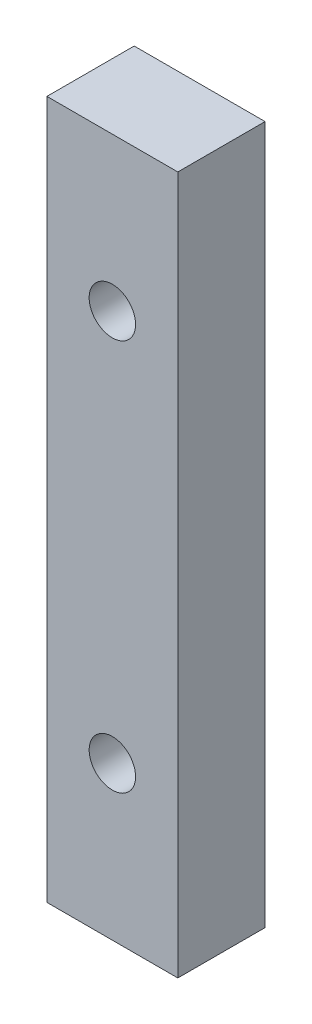
ISO-10303-21;
HEADER;
FILE_DESCRIPTION(('STEP AP214'),'2;1');
FILE_NAME('part.step','',(''),(''),'','','');
FILE_SCHEMA(('AUTOMOTIVE_DESIGN { 1 0 10303 214 1 1 1 1 }'));
ENDSEC;
DATA;
#1=APPLICATION_CONTEXT('core data for automotive mechanical design processes');
#2=APPLICATION_PROTOCOL_DEFINITION('international standard','automotive_design',2000,#1);
#3=PRODUCT_CONTEXT('',#1,'mechanical');
#4=PRODUCT('Part','Part','',(#3));
#5=PRODUCT_RELATED_PRODUCT_CATEGORY('part','',(#4));
#6=PRODUCT_DEFINITION_FORMATION('','',#4);
#7=PRODUCT_DEFINITION_CONTEXT('part definition',#1,'design');
#8=PRODUCT_DEFINITION('design','',#6,#7);
#9=PRODUCT_DEFINITION_SHAPE('','',#8);
#10=(LENGTH_UNIT() NAMED_UNIT(*) SI_UNIT(.MILLI.,.METRE.));
#11=(NAMED_UNIT(*) PLANE_ANGLE_UNIT() SI_UNIT($,.RADIAN.));
#12=(NAMED_UNIT(*) SI_UNIT($,.STERADIAN.) SOLID_ANGLE_UNIT());
#13=UNCERTAINTY_MEASURE_WITH_UNIT(LENGTH_MEASURE(1.E-05),#10,'distance_accuracy_value','');
#14=(GEOMETRIC_REPRESENTATION_CONTEXT(3) GLOBAL_UNCERTAINTY_ASSIGNED_CONTEXT((#13)) GLOBAL_UNIT_ASSIGNED_CONTEXT((#10,
#11,#12)) REPRESENTATION_CONTEXT('',''));
#15=CARTESIAN_POINT('',(0.,0.,0.));
#16=DIRECTION('',(0.,0.,1.));
#17=DIRECTION('',(1.,0.,0.));
#18=AXIS2_PLACEMENT_3D('',#15,#16,#17);
#19=CARTESIAN_POINT('',(-9.52500000000001,50.8,12.7));
#20=DIRECTION('',(1.,0.,0.));
#21=DIRECTION('',(0.,1.,0.));
#22=AXIS2_PLACEMENT_3D('',#19,#20,#21);
#23=PLANE('',#22);
#24=DIRECTION('',(0.,-1.,0.));
#25=VECTOR('',#24,1.);
#26=CARTESIAN_POINT('',(-9.52500000000001,50.8,0.));
#27=LINE('',#26,#25);
#28=CARTESIAN_POINT('',(-9.52500000000001,50.8,0.));
#29=VERTEX_POINT('',#28);
#30=CARTESIAN_POINT('',(-9.525,-50.8,0.));
#31=VERTEX_POINT('',#30);
#32=EDGE_CURVE('E97',#29,#31,#27,.T.);
#33=ORIENTED_EDGE('',*,*,#32,.T.);
#34=DIRECTION('',(0.,0.,-1.));
#35=VECTOR('',#34,1.);
#36=CARTESIAN_POINT('',(-9.525,-50.8,12.7));
#37=LINE('',#36,#35);
#38=CARTESIAN_POINT('',(-9.525,-50.8,12.7));
#39=VERTEX_POINT('',#38);
#40=EDGE_CURVE('E11',#39,#31,#37,.T.);
#41=ORIENTED_EDGE('',*,*,#40,.F.);
#42=DIRECTION('',(0.,-1.,0.));
#43=VECTOR('',#42,1.);
#44=CARTESIAN_POINT('',(-9.52500000000001,50.8,12.7));
#45=LINE('',#44,#43);
#46=CARTESIAN_POINT('',(-9.52500000000001,50.8,12.7));
#47=VERTEX_POINT('',#46);
#48=EDGE_CURVE('E85',#47,#39,#45,.T.);
#49=ORIENTED_EDGE('',*,*,#48,.F.);
#50=DIRECTION('',(0.,0.,-1.));
#51=VECTOR('',#50,1.);
#52=CARTESIAN_POINT('',(-9.52500000000001,50.8,12.7));
#53=LINE('',#52,#51);
#54=EDGE_CURVE('E93',#47,#29,#53,.T.);
#55=ORIENTED_EDGE('',*,*,#54,.T.);
#56=EDGE_LOOP('',(#33,#41,#49,#55));
#57=FACE_BOUND('',#56,.T.);
#58=ADVANCED_FACE('F34',(#57),#23,.F.);
#59=CARTESIAN_POINT('',(-9.525,-50.8,12.7));
#60=DIRECTION('',(0.,1.,0.));
#61=DIRECTION('',(0.,0.,1.));
#62=AXIS2_PLACEMENT_3D('',#59,#60,#61);
#63=PLANE('',#62);
#64=DIRECTION('',(1.,0.,0.));
#65=VECTOR('',#64,1.);
#66=CARTESIAN_POINT('',(-9.525,-50.8,0.));
#67=LINE('',#66,#65);
#68=CARTESIAN_POINT('',(9.525,-50.8,0.));
#69=VERTEX_POINT('',#68);
#70=EDGE_CURVE('E89',#31,#69,#67,.T.);
#71=ORIENTED_EDGE('',*,*,#70,.T.);
#72=DIRECTION('',(0.,0.,-1.));
#73=VECTOR('',#72,1.);
#74=CARTESIAN_POINT('',(9.525,-50.8,12.7));
#75=LINE('',#74,#73);
#76=CARTESIAN_POINT('',(9.525,-50.8,12.7));
#77=VERTEX_POINT('',#76);
#78=EDGE_CURVE('E42',#77,#69,#75,.T.);
#79=ORIENTED_EDGE('',*,*,#78,.F.);
#80=DIRECTION('',(1.,0.,0.));
#81=VECTOR('',#80,1.);
#82=CARTESIAN_POINT('',(-9.525,-50.8,12.7));
#83=LINE('',#82,#81);
#84=EDGE_CURVE('E80',#39,#77,#83,.T.);
#85=ORIENTED_EDGE('',*,*,#84,.F.);
#86=ORIENTED_EDGE('',*,*,#40,.T.);
#87=EDGE_LOOP('',(#71,#79,#85,#86));
#88=FACE_BOUND('',#87,.T.);
#89=ADVANCED_FACE('F88',(#88),#63,.F.);
#90=CARTESIAN_POINT('',(9.52499999999999,50.8,12.7));
#91=DIRECTION('',(-1.,0.,0.));
#92=DIRECTION('',(0.,-1.,0.));
#93=AXIS2_PLACEMENT_3D('',#90,#91,#92);
#94=PLANE('',#93);
#95=DIRECTION('',(0.,1.,0.));
#96=VECTOR('',#95,1.);
#97=CARTESIAN_POINT('',(9.52499999999999,50.8,0.));
#98=LINE('',#97,#96);
#99=CARTESIAN_POINT('',(9.52499999999999,50.8,0.));
#100=VERTEX_POINT('',#99);
#101=EDGE_CURVE('E67',#69,#100,#98,.T.);
#102=ORIENTED_EDGE('',*,*,#101,.T.);
#103=DIRECTION('',(0.,0.,-1.));
#104=VECTOR('',#103,1.);
#105=CARTESIAN_POINT('',(9.52499999999999,50.8,12.7));
#106=LINE('',#105,#104);
#107=CARTESIAN_POINT('',(9.52499999999999,50.8,12.7));
#108=VERTEX_POINT('',#107);
#109=EDGE_CURVE('E90',#108,#100,#106,.T.);
#110=ORIENTED_EDGE('',*,*,#109,.F.);
#111=DIRECTION('',(0.,1.,0.));
#112=VECTOR('',#111,1.);
#113=CARTESIAN_POINT('',(9.52499999999999,50.8,12.7));
#114=LINE('',#113,#112);
#115=EDGE_CURVE('E83',#77,#108,#114,.T.);
#116=ORIENTED_EDGE('',*,*,#115,.F.);
#117=ORIENTED_EDGE('',*,*,#78,.T.);
#118=EDGE_LOOP('',(#102,#110,#116,#117));
#119=FACE_BOUND('',#118,.T.);
#120=ADVANCED_FACE('F91',(#119),#94,.F.);
#121=CARTESIAN_POINT('',(-9.52500000000001,50.8,12.7));
#122=DIRECTION('',(0.,-1.,0.));
#123=DIRECTION('',(0.,0.,-1.));
#124=AXIS2_PLACEMENT_3D('',#121,#122,#123);
#125=PLANE('',#124);
#126=DIRECTION('',(-1.,0.,0.));
#127=VECTOR('',#126,1.);
#128=CARTESIAN_POINT('',(-9.52500000000001,50.8,0.));
#129=LINE('',#128,#127);
#130=EDGE_CURVE('E73',#100,#29,#129,.T.);
#131=ORIENTED_EDGE('',*,*,#130,.T.);
#132=ORIENTED_EDGE('',*,*,#54,.F.);
#133=DIRECTION('',(-1.,0.,0.));
#134=VECTOR('',#133,1.);
#135=CARTESIAN_POINT('',(-9.52500000000001,50.8,12.7));
#136=LINE('',#135,#134);
#137=EDGE_CURVE('E50',#108,#47,#136,.T.);
#138=ORIENTED_EDGE('',*,*,#137,.F.);
#139=ORIENTED_EDGE('',*,*,#109,.T.);
#140=EDGE_LOOP('',(#131,#132,#138,#139));
#141=FACE_BOUND('',#140,.T.);
#142=ADVANCED_FACE('F105',(#141),#125,.F.);
#143=CARTESIAN_POINT('',(0.,0.,12.7));
#144=DIRECTION('',(0.,0.,1.));
#145=DIRECTION('',(1.,0.,0.));
#146=AXIS2_PLACEMENT_3D('',#143,#144,#145);
#147=PLANE('',#146);
#148=CARTESIAN_POINT('',(0.,28.5,12.7));
#149=DIRECTION('',(0.,0.,1.));
#150=DIRECTION('',(1.,0.,0.));
#151=AXIS2_PLACEMENT_3D('',#148,#149,#150);
#152=CIRCLE('',#151,3.37819999999999);
#153=CARTESIAN_POINT('',(3.37819999999999,28.5,12.7));
#154=VERTEX_POINT('',#153);
#155=EDGE_CURVE('E119',#154,#154,#152,.T.);
#156=ORIENTED_EDGE('',*,*,#155,.F.);
#157=EDGE_LOOP('',(#156));
#158=FACE_BOUND('',#157,.T.);
#159=CARTESIAN_POINT('',(0.,-28.5,12.7));
#160=DIRECTION('',(0.,0.,1.));
#161=DIRECTION('',(1.,0.,0.));
#162=AXIS2_PLACEMENT_3D('',#159,#160,#161);
#163=CIRCLE('',#162,3.37819999999999);
#164=CARTESIAN_POINT('',(3.37819999999999,-28.5,12.7));
#165=VERTEX_POINT('',#164);
#166=EDGE_CURVE('E113',#165,#165,#163,.T.);
#167=ORIENTED_EDGE('',*,*,#166,.F.);
#168=EDGE_LOOP('',(#167));
#169=FACE_BOUND('',#168,.T.);
#170=ORIENTED_EDGE('',*,*,#48,.T.);
#171=ORIENTED_EDGE('',*,*,#84,.T.);
#172=ORIENTED_EDGE('',*,*,#115,.T.);
#173=ORIENTED_EDGE('',*,*,#137,.T.);
#174=EDGE_LOOP('',(#170,#171,#172,#173));
#175=FACE_BOUND('',#174,.T.);
#176=ADVANCED_FACE('F81',(#158,#169,#175),#147,.T.);
#177=CARTESIAN_POINT('',(0.,0.,0.));
#178=DIRECTION('',(0.,0.,1.));
#179=DIRECTION('',(1.,0.,0.));
#180=AXIS2_PLACEMENT_3D('',#177,#178,#179);
#181=PLANE('',#180);
#182=CARTESIAN_POINT('',(0.,28.5,0.));
#183=DIRECTION('',(0.,0.,1.));
#184=DIRECTION('',(1.,0.,0.));
#185=AXIS2_PLACEMENT_3D('',#182,#183,#184);
#186=CIRCLE('',#185,3.3782);
#187=CARTESIAN_POINT('',(3.3782,28.5,0.));
#188=VERTEX_POINT('',#187);
#189=EDGE_CURVE('E116',#188,#188,#186,.T.);
#190=ORIENTED_EDGE('',*,*,#189,.T.);
#191=EDGE_LOOP('',(#190));
#192=FACE_BOUND('',#191,.T.);
#193=CARTESIAN_POINT('',(0.,-28.5,0.));
#194=DIRECTION('',(0.,0.,1.));
#195=DIRECTION('',(1.,0.,0.));
#196=AXIS2_PLACEMENT_3D('',#193,#194,#195);
#197=CIRCLE('',#196,3.3782);
#198=CARTESIAN_POINT('',(3.3782,-28.5,0.));
#199=VERTEX_POINT('',#198);
#200=EDGE_CURVE('E100',#199,#199,#197,.T.);
#201=ORIENTED_EDGE('',*,*,#200,.T.);
#202=EDGE_LOOP('',(#201));
#203=FACE_BOUND('',#202,.T.);
#204=ORIENTED_EDGE('',*,*,#32,.F.);
#205=ORIENTED_EDGE('',*,*,#130,.F.);
#206=ORIENTED_EDGE('',*,*,#101,.F.);
#207=ORIENTED_EDGE('',*,*,#70,.F.);
#208=EDGE_LOOP('',(#204,#205,#206,#207));
#209=FACE_BOUND('',#208,.T.);
#210=ADVANCED_FACE('F108',(#192,#203,#209),#181,.F.);
#211=CARTESIAN_POINT('',(0.,-28.5,12.7));
#212=DIRECTION('',(0.,0.,1.));
#213=DIRECTION('',(1.,0.,0.));
#214=AXIS2_PLACEMENT_3D('',#211,#212,#213);
#215=CYLINDRICAL_SURFACE('',#214,3.37819999999999);
#216=ORIENTED_EDGE('',*,*,#200,.F.);
#217=EDGE_LOOP('',(#216));
#218=FACE_BOUND('',#217,.T.);
#219=ORIENTED_EDGE('',*,*,#166,.T.);
#220=EDGE_LOOP('',(#219));
#221=FACE_BOUND('',#220,.T.);
#222=ADVANCED_FACE('F130',(#218,#221),#215,.F.);
#223=CARTESIAN_POINT('',(0.,28.5,12.7));
#224=DIRECTION('',(0.,0.,1.));
#225=DIRECTION('',(1.,0.,0.));
#226=AXIS2_PLACEMENT_3D('',#223,#224,#225);
#227=CYLINDRICAL_SURFACE('',#226,3.37819999999999);
#228=ORIENTED_EDGE('',*,*,#189,.F.);
#229=EDGE_LOOP('',(#228));
#230=FACE_BOUND('',#229,.T.);
#231=ORIENTED_EDGE('',*,*,#155,.T.);
#232=EDGE_LOOP('',(#231));
#233=FACE_BOUND('',#232,.T.);
#234=ADVANCED_FACE('F123',(#230,#233),#227,.F.);
#235=CLOSED_SHELL('',(#58,#89,#120,#142,#176,#210,#222,#234));
#236=MANIFOLD_SOLID_BREP('B2',#235);
#237=ADVANCED_BREP_SHAPE_REPRESENTATION('',(#18,#236),#14);
#238=SHAPE_DEFINITION_REPRESENTATION(#9,#237);
ENDSEC;
END-ISO-10303-21;
